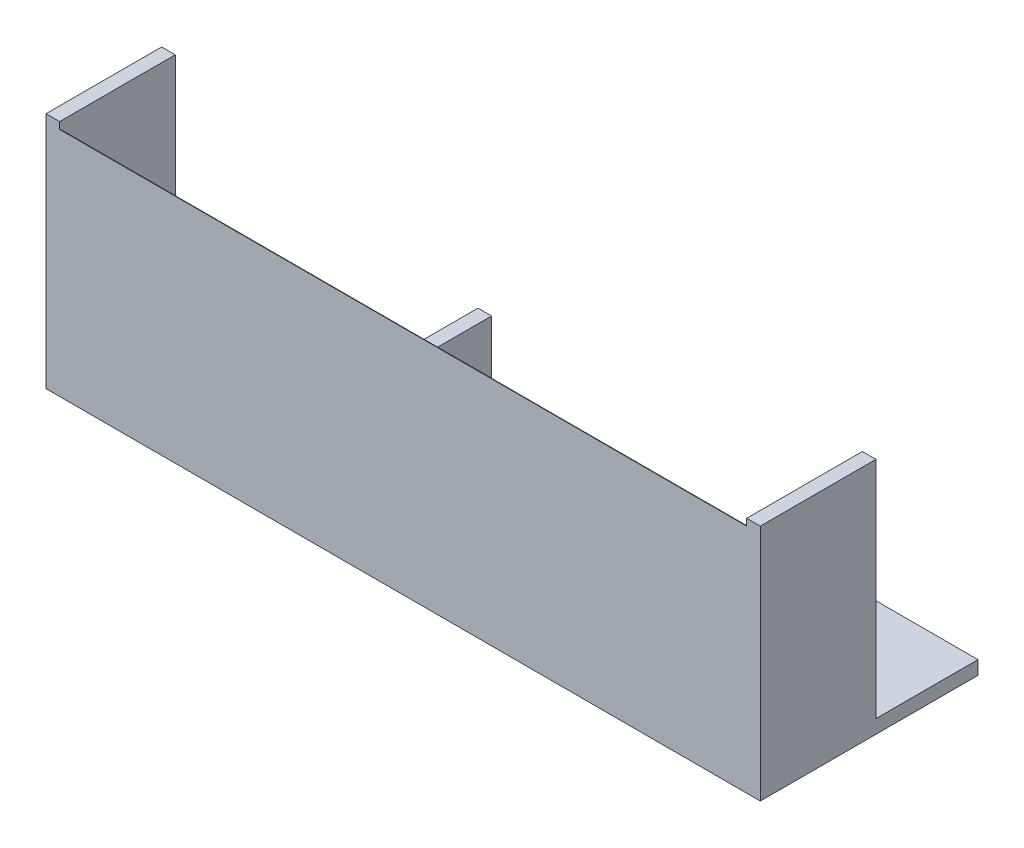
ISO-10303-21;
HEADER;
FILE_DESCRIPTION(('STEP AP214'),'2;1');
FILE_NAME('part.step','',(''),(''),'','','');
FILE_SCHEMA(('AUTOMOTIVE_DESIGN { 1 0 10303 214 1 1 1 1 }'));
ENDSEC;
DATA;
#1=APPLICATION_CONTEXT('core data for automotive mechanical design processes');
#2=APPLICATION_PROTOCOL_DEFINITION('international standard','automotive_design',2000,#1);
#3=PRODUCT_CONTEXT('',#1,'mechanical');
#4=PRODUCT('Part','Part','',(#3));
#5=PRODUCT_RELATED_PRODUCT_CATEGORY('part','',(#4));
#6=PRODUCT_DEFINITION_FORMATION('','',#4);
#7=PRODUCT_DEFINITION_CONTEXT('part definition',#1,'design');
#8=PRODUCT_DEFINITION('design','',#6,#7);
#9=PRODUCT_DEFINITION_SHAPE('','',#8);
#10=(LENGTH_UNIT() NAMED_UNIT(*) SI_UNIT(.MILLI.,.METRE.));
#11=(NAMED_UNIT(*) PLANE_ANGLE_UNIT() SI_UNIT($,.RADIAN.));
#12=(NAMED_UNIT(*) SI_UNIT($,.STERADIAN.) SOLID_ANGLE_UNIT());
#13=UNCERTAINTY_MEASURE_WITH_UNIT(LENGTH_MEASURE(1.E-05),#10,'distance_accuracy_value','');
#14=(GEOMETRIC_REPRESENTATION_CONTEXT(3) GLOBAL_UNCERTAINTY_ASSIGNED_CONTEXT((#13)) GLOBAL_UNIT_ASSIGNED_CONTEXT((#10,
#11,#12)) REPRESENTATION_CONTEXT('',''));
#15=CARTESIAN_POINT('',(0.,0.,0.));
#16=DIRECTION('',(0.,0.,1.));
#17=DIRECTION('',(1.,0.,0.));
#18=AXIS2_PLACEMENT_3D('',#15,#16,#17);
#19=CARTESIAN_POINT('',(0.,0.,0.));
#20=DIRECTION('',(0.,0.,1.));
#21=DIRECTION('',(1.,0.,0.));
#22=AXIS2_PLACEMENT_3D('',#19,#20,#21);
#23=PLANE('',#22);
#24=DIRECTION('',(0.,1.,0.));
#25=VECTOR('',#24,1.);
#26=CARTESIAN_POINT('',(-11.9657534246575,53.4349315068493,0.));
#27=LINE('',#26,#25);
#28=CARTESIAN_POINT('',(-11.9657534246575,53.4349315068493,0.));
#29=VERTEX_POINT('',#28);
#30=CARTESIAN_POINT('',(-11.9657534246575,109.434931506849,0.));
#31=VERTEX_POINT('',#30);
#32=EDGE_CURVE('E167',#29,#31,#27,.T.);
#33=ORIENTED_EDGE('',*,*,#32,.F.);
#34=DIRECTION('',(-1.,0.,0.));
#35=VECTOR('',#34,1.);
#36=CARTESIAN_POINT('',(-114.965753424658,53.4349315068493,0.));
#37=LINE('',#36,#35);
#38=CARTESIAN_POINT('',(-110.965753424658,53.4349315068493,0.));
#39=VERTEX_POINT('',#38);
#40=EDGE_CURVE('E209',#29,#39,#37,.T.);
#41=ORIENTED_EDGE('',*,*,#40,.T.);
#42=DIRECTION('',(0.,1.,0.));
#43=VECTOR('',#42,1.);
#44=CARTESIAN_POINT('',(-110.965753424658,119.434931506849,0.));
#45=LINE('',#44,#43);
#46=CARTESIAN_POINT('',(-110.965753424658,109.434931506849,0.));
#47=VERTEX_POINT('',#46);
#48=EDGE_CURVE('E190',#39,#47,#45,.T.);
#49=ORIENTED_EDGE('',*,*,#48,.T.);
#50=DIRECTION('',(-1.,0.,0.));
#51=VECTOR('',#50,1.);
#52=CARTESIAN_POINT('',(0.,109.434931506849,0.));
#53=LINE('',#52,#51);
#54=EDGE_CURVE('E262',#47,#31,#53,.F.);
#55=ORIENTED_EDGE('',*,*,#54,.T.);
#56=EDGE_LOOP('',(#33,#41,#49,#55));
#57=FACE_BOUND('',#56,.T.);
#58=ADVANCED_FACE('F36',(#57),#23,.F.);
#59=DIRECTION('',(0.,-1.,0.));
#60=VECTOR('',#59,1.);
#61=CARTESIAN_POINT('',(-7.96575342465753,53.4349315068493,0.));
#62=LINE('',#61,#60);
#63=CARTESIAN_POINT('',(-7.96575342465752,109.434931506849,0.));
#64=VERTEX_POINT('',#63);
#65=CARTESIAN_POINT('',(-7.96575342465752,53.4349315068493,0.));
#66=VERTEX_POINT('',#65);
#67=EDGE_CURVE('E164',#64,#66,#62,.T.);
#68=ORIENTED_EDGE('',*,*,#67,.F.);
#69=CARTESIAN_POINT('',(91.0342465753425,109.434931506849,0.));
#70=VERTEX_POINT('',#69);
#71=EDGE_CURVE('E261',#64,#70,#53,.F.);
#72=ORIENTED_EDGE('',*,*,#71,.T.);
#73=DIRECTION('',(0.,-1.,0.));
#74=VECTOR('',#73,1.);
#75=CARTESIAN_POINT('',(91.0342465753425,119.434931506849,0.));
#76=LINE('',#75,#74);
#77=CARTESIAN_POINT('',(91.0342465753425,53.4349315068493,0.));
#78=VERTEX_POINT('',#77);
#79=EDGE_CURVE('E168',#70,#78,#76,.T.);
#80=ORIENTED_EDGE('',*,*,#79,.T.);
#81=EDGE_CURVE('E216',#78,#66,#37,.T.);
#82=ORIENTED_EDGE('',*,*,#81,.T.);
#83=EDGE_LOOP('',(#68,#72,#80,#82));
#84=FACE_BOUND('',#83,.T.);
#85=ADVANCED_FACE('F287',(#84),#23,.F.);
#86=CARTESIAN_POINT('',(-114.965753424658,53.4349315068493,-60.));
#87=DIRECTION('',(0.,1.,0.));
#88=DIRECTION('',(0.,0.,1.));
#89=AXIS2_PLACEMENT_3D('',#86,#87,#88);
#90=PLANE('',#89);
#91=ORIENTED_EDGE('',*,*,#40,.F.);
#92=DIRECTION('',(0.,0.,1.));
#93=VECTOR('',#92,1.);
#94=CARTESIAN_POINT('',(-11.9657534246575,53.4349315068493,-20.));
#95=LINE('',#94,#93);
#96=CARTESIAN_POINT('',(-11.9657534246575,53.4349315068493,-20.));
#97=VERTEX_POINT('',#96);
#98=EDGE_CURVE('E51',#97,#29,#95,.T.);
#99=ORIENTED_EDGE('',*,*,#98,.F.);
#100=DIRECTION('',(-1.,0.,0.));
#101=VECTOR('',#100,1.);
#102=CARTESIAN_POINT('',(-11.9657534246575,53.4349315068493,-20.));
#103=LINE('',#102,#101);
#104=CARTESIAN_POINT('',(-7.96575342465752,53.4349315068493,-20.));
#105=VERTEX_POINT('',#104);
#106=EDGE_CURVE('E55',#105,#97,#103,.T.);
#107=ORIENTED_EDGE('',*,*,#106,.F.);
#108=DIRECTION('',(0.,0.,1.));
#109=VECTOR('',#108,1.);
#110=CARTESIAN_POINT('',(-7.96575342465753,53.4349315068493,-20.));
#111=LINE('',#110,#109);
#112=EDGE_CURVE('E172',#105,#66,#111,.T.);
#113=ORIENTED_EDGE('',*,*,#112,.T.);
#114=ORIENTED_EDGE('',*,*,#81,.F.);
#115=DIRECTION('',(0.,0.,1.));
#116=VECTOR('',#115,1.);
#117=CARTESIAN_POINT('',(91.0342465753425,53.4349315068493,-30.));
#118=LINE('',#117,#116);
#119=CARTESIAN_POINT('',(91.0342465753425,53.4349315068493,-30.));
#120=VERTEX_POINT('',#119);
#121=EDGE_CURVE('E187',#120,#78,#118,.T.);
#122=ORIENTED_EDGE('',*,*,#121,.F.);
#123=DIRECTION('',(1.,0.,0.));
#124=VECTOR('',#123,1.);
#125=CARTESIAN_POINT('',(95.0342465753425,53.4349315068493,-30.));
#126=LINE('',#125,#124);
#127=CARTESIAN_POINT('',(95.0342465753425,53.4349315068493,-30.));
#128=VERTEX_POINT('',#127);
#129=EDGE_CURVE('E184',#120,#128,#126,.T.);
#130=ORIENTED_EDGE('',*,*,#129,.T.);
#131=DIRECTION('',(0.,0.,1.));
#132=VECTOR('',#131,1.);
#133=CARTESIAN_POINT('',(95.0342465753425,53.4349315068493,-60.));
#134=LINE('',#133,#132);
#135=CARTESIAN_POINT('',(95.0342465753425,53.4349315068493,-60.));
#136=VERTEX_POINT('',#135);
#137=EDGE_CURVE('E225',#136,#128,#134,.T.);
#138=ORIENTED_EDGE('',*,*,#137,.F.);
#139=DIRECTION('',(-1.,0.,0.));
#140=VECTOR('',#139,1.);
#141=CARTESIAN_POINT('',(-114.965753424658,53.4349315068493,-60.));
#142=LINE('',#141,#140);
#143=CARTESIAN_POINT('',(-114.965753424658,53.4349315068493,-60.));
#144=VERTEX_POINT('',#143);
#145=EDGE_CURVE('E222',#136,#144,#142,.T.);
#146=ORIENTED_EDGE('',*,*,#145,.T.);
#147=DIRECTION('',(0.,0.,1.));
#148=VECTOR('',#147,1.);
#149=CARTESIAN_POINT('',(-114.965753424658,53.4349315068493,-60.));
#150=LINE('',#149,#148);
#151=CARTESIAN_POINT('',(-114.965753424658,53.4349315068493,-30.));
#152=VERTEX_POINT('',#151);
#153=EDGE_CURVE('E228',#144,#152,#150,.T.);
#154=ORIENTED_EDGE('',*,*,#153,.T.);
#155=DIRECTION('',(1.,0.,0.));
#156=VECTOR('',#155,1.);
#157=CARTESIAN_POINT('',(-114.965753424658,53.4349315068493,-30.));
#158=LINE('',#157,#156);
#159=CARTESIAN_POINT('',(-110.965753424658,53.4349315068493,-30.));
#160=VERTEX_POINT('',#159);
#161=EDGE_CURVE('E195',#152,#160,#158,.T.);
#162=ORIENTED_EDGE('',*,*,#161,.T.);
#163=DIRECTION('',(0.,0.,1.));
#164=VECTOR('',#163,1.);
#165=CARTESIAN_POINT('',(-110.965753424658,53.4349315068493,-30.));
#166=LINE('',#165,#164);
#167=EDGE_CURVE('E204',#160,#39,#166,.T.);
#168=ORIENTED_EDGE('',*,*,#167,.T.);
#169=EDGE_LOOP('',(#91,#99,#107,#113,#114,#122,#130,#138,#146,#154,#162,#168));
#170=FACE_BOUND('',#169,.T.);
#171=ADVANCED_FACE('F284',(#170),#90,.T.);
#172=CARTESIAN_POINT('',(-114.965753424658,119.434931506849,4.));
#173=DIRECTION('',(0.,-1.,0.));
#174=DIRECTION('',(0.,0.,-1.));
#175=AXIS2_PLACEMENT_3D('',#172,#173,#174);
#176=PLANE('',#175);
#177=DIRECTION('',(-1.,0.,0.));
#178=VECTOR('',#177,1.);
#179=CARTESIAN_POINT('',(-114.965753424658,119.434931506849,4.));
#180=LINE('',#179,#178);
#181=CARTESIAN_POINT('',(-110.965753424658,119.434931506849,4.));
#182=VERTEX_POINT('',#181);
#183=CARTESIAN_POINT('',(-114.965753424658,119.434931506849,4.));
#184=VERTEX_POINT('',#183);
#185=EDGE_CURVE('E236',#182,#184,#180,.T.);
#186=ORIENTED_EDGE('',*,*,#185,.F.);
#187=DIRECTION('',(0.,0.,1.));
#188=VECTOR('',#187,1.);
#189=CARTESIAN_POINT('',(-110.965753424658,119.434931506849,-30.));
#190=LINE('',#189,#188);
#191=CARTESIAN_POINT('',(-110.965753424658,119.434931506849,-30.));
#192=VERTEX_POINT('',#191);
#193=EDGE_CURVE('E207',#192,#182,#190,.T.);
#194=ORIENTED_EDGE('',*,*,#193,.F.);
#195=DIRECTION('',(-1.,0.,0.));
#196=VECTOR('',#195,1.);
#197=CARTESIAN_POINT('',(-114.965753424658,119.434931506849,-30.));
#198=LINE('',#197,#196);
#199=CARTESIAN_POINT('',(-114.965753424658,119.434931506849,-30.));
#200=VERTEX_POINT('',#199);
#201=EDGE_CURVE('E201',#192,#200,#198,.T.);
#202=ORIENTED_EDGE('',*,*,#201,.T.);
#203=DIRECTION('',(0.,0.,-1.));
#204=VECTOR('',#203,1.);
#205=CARTESIAN_POINT('',(-114.965753424658,119.434931506849,4.));
#206=LINE('',#205,#204);
#207=EDGE_CURVE('E248',#184,#200,#206,.T.);
#208=ORIENTED_EDGE('',*,*,#207,.F.);
#209=EDGE_LOOP('',(#186,#194,#202,#208));
#210=FACE_BOUND('',#209,.T.);
#211=ADVANCED_FACE('F320',(#210),#176,.F.);
#212=CARTESIAN_POINT('',(95.0342465753425,119.434931506849,4.));
#213=DIRECTION('',(-1.,0.,0.));
#214=DIRECTION('',(0.,0.,1.));
#215=AXIS2_PLACEMENT_3D('',#212,#213,#214);
#216=PLANE('',#215);
#217=DIRECTION('',(0.,1.,0.));
#218=VECTOR('',#217,1.);
#219=CARTESIAN_POINT('',(95.0342465753425,119.434931506849,-30.));
#220=LINE('',#219,#218);
#221=CARTESIAN_POINT('',(95.0342465753425,119.434931506849,-30.));
#222=VERTEX_POINT('',#221);
#223=EDGE_CURVE('E170',#128,#222,#220,.T.);
#224=ORIENTED_EDGE('',*,*,#223,.T.);
#225=DIRECTION('',(0.,0.,-1.));
#226=VECTOR('',#225,1.);
#227=CARTESIAN_POINT('',(95.0342465753425,119.434931506849,4.));
#228=LINE('',#227,#226);
#229=CARTESIAN_POINT('',(95.0342465753425,119.434931506849,4.));
#230=VERTEX_POINT('',#229);
#231=EDGE_CURVE('E250',#230,#222,#228,.T.);
#232=ORIENTED_EDGE('',*,*,#231,.F.);
#233=DIRECTION('',(0.,1.,0.));
#234=VECTOR('',#233,1.);
#235=CARTESIAN_POINT('',(95.0342465753425,119.434931506849,4.));
#236=LINE('',#235,#234);
#237=CARTESIAN_POINT('',(95.0342465753425,49.4349315068493,4.));
#238=VERTEX_POINT('',#237);
#239=EDGE_CURVE('E231',#238,#230,#236,.T.);
#240=ORIENTED_EDGE('',*,*,#239,.F.);
#241=DIRECTION('',(0.,0.,-1.));
#242=VECTOR('',#241,1.);
#243=CARTESIAN_POINT('',(95.0342465753425,49.4349315068493,4.));
#244=LINE('',#243,#242);
#245=CARTESIAN_POINT('',(95.0342465753425,49.4349315068493,-60.));
#246=VERTEX_POINT('',#245);
#247=EDGE_CURVE('E244',#238,#246,#244,.T.);
#248=ORIENTED_EDGE('',*,*,#247,.T.);
#249=DIRECTION('',(0.,1.,0.));
#250=VECTOR('',#249,1.);
#251=CARTESIAN_POINT('',(95.0342465753425,49.4349315068493,-60.));
#252=LINE('',#251,#250);
#253=EDGE_CURVE('E219',#246,#136,#252,.T.);
#254=ORIENTED_EDGE('',*,*,#253,.T.);
#255=ORIENTED_EDGE('',*,*,#137,.T.);
#256=EDGE_LOOP('',(#224,#232,#240,#248,#254,#255));
#257=FACE_BOUND('',#256,.T.);
#258=ADVANCED_FACE('F318',(#257),#216,.F.);
#259=DIRECTION('',(0.,0.,1.));
#260=VECTOR('',#259,1.);
#261=CARTESIAN_POINT('',(91.0342465753425,119.434931506849,-30.));
#262=LINE('',#261,#260);
#263=CARTESIAN_POINT('',(91.0342465753425,119.434931506849,-30.));
#264=VERTEX_POINT('',#263);
#265=CARTESIAN_POINT('',(91.0342465753425,119.434931506849,4.));
#266=VERTEX_POINT('',#265);
#267=EDGE_CURVE('E185',#264,#266,#262,.T.);
#268=ORIENTED_EDGE('',*,*,#267,.T.);
#269=EDGE_CURVE('E237',#230,#266,#180,.T.);
#270=ORIENTED_EDGE('',*,*,#269,.F.);
#271=ORIENTED_EDGE('',*,*,#231,.T.);
#272=DIRECTION('',(-1.,0.,0.));
#273=VECTOR('',#272,1.);
#274=CARTESIAN_POINT('',(95.0342465753425,119.434931506849,-30.));
#275=LINE('',#274,#273);
#276=EDGE_CURVE('E178',#222,#264,#275,.T.);
#277=ORIENTED_EDGE('',*,*,#276,.T.);
#278=EDGE_LOOP('',(#268,#270,#271,#277));
#279=FACE_BOUND('',#278,.T.);
#280=ADVANCED_FACE('F315',(#279),#176,.F.);
#281=CARTESIAN_POINT('',(-114.965753424658,119.434931506849,4.));
#282=DIRECTION('',(1.,0.,0.));
#283=DIRECTION('',(0.,1.,0.));
#284=AXIS2_PLACEMENT_3D('',#281,#282,#283);
#285=PLANE('',#284);
#286=ORIENTED_EDGE('',*,*,#207,.T.);
#287=DIRECTION('',(0.,-1.,0.));
#288=VECTOR('',#287,1.);
#289=CARTESIAN_POINT('',(-114.965753424658,119.434931506849,-30.));
#290=LINE('',#289,#288);
#291=EDGE_CURVE('E192',#200,#152,#290,.T.);
#292=ORIENTED_EDGE('',*,*,#291,.T.);
#293=ORIENTED_EDGE('',*,*,#153,.F.);
#294=DIRECTION('',(0.,-1.,0.));
#295=VECTOR('',#294,1.);
#296=CARTESIAN_POINT('',(-114.965753424658,49.4349315068493,-60.));
#297=LINE('',#296,#295);
#298=CARTESIAN_POINT('',(-114.965753424658,49.4349315068493,-60.));
#299=VERTEX_POINT('',#298);
#300=EDGE_CURVE('E212',#144,#299,#297,.T.);
#301=ORIENTED_EDGE('',*,*,#300,.T.);
#302=DIRECTION('',(0.,0.,-1.));
#303=VECTOR('',#302,1.);
#304=CARTESIAN_POINT('',(-114.965753424658,49.4349315068493,4.));
#305=LINE('',#304,#303);
#306=CARTESIAN_POINT('',(-114.965753424658,49.4349315068493,4.));
#307=VERTEX_POINT('',#306);
#308=EDGE_CURVE('E246',#307,#299,#305,.T.);
#309=ORIENTED_EDGE('',*,*,#308,.F.);
#310=DIRECTION('',(0.,-1.,0.));
#311=VECTOR('',#310,1.);
#312=CARTESIAN_POINT('',(-114.965753424658,119.434931506849,4.));
#313=LINE('',#312,#311);
#314=EDGE_CURVE('E240',#184,#307,#313,.T.);
#315=ORIENTED_EDGE('',*,*,#314,.F.);
#316=EDGE_LOOP('',(#286,#292,#293,#301,#309,#315));
#317=FACE_BOUND('',#316,.T.);
#318=ADVANCED_FACE('F311',(#317),#285,.F.);
#319=CARTESIAN_POINT('',(-114.965753424658,49.4349315068493,4.));
#320=DIRECTION('',(0.,1.,0.));
#321=DIRECTION('',(0.,0.,1.));
#322=AXIS2_PLACEMENT_3D('',#319,#320,#321);
#323=PLANE('',#322);
#324=ORIENTED_EDGE('',*,*,#308,.T.);
#325=DIRECTION('',(1.,0.,0.));
#326=VECTOR('',#325,1.);
#327=CARTESIAN_POINT('',(-114.965753424658,49.4349315068493,-60.));
#328=LINE('',#327,#326);
#329=EDGE_CURVE('E215',#299,#246,#328,.T.);
#330=ORIENTED_EDGE('',*,*,#329,.T.);
#331=ORIENTED_EDGE('',*,*,#247,.F.);
#332=DIRECTION('',(1.,0.,0.));
#333=VECTOR('',#332,1.);
#334=CARTESIAN_POINT('',(-114.965753424658,49.4349315068493,4.));
#335=LINE('',#334,#333);
#336=EDGE_CURVE('E242',#307,#238,#335,.T.);
#337=ORIENTED_EDGE('',*,*,#336,.F.);
#338=EDGE_LOOP('',(#324,#330,#331,#337));
#339=FACE_BOUND('',#338,.T.);
#340=ADVANCED_FACE('F308',(#339),#323,.F.);
#341=CARTESIAN_POINT('',(0.,0.,4.));
#342=DIRECTION('',(0.,0.,1.));
#343=DIRECTION('',(1.,0.,0.));
#344=AXIS2_PLACEMENT_3D('',#341,#342,#343);
#345=PLANE('',#344);
#346=DIRECTION('',(-1.,0.,0.));
#347=VECTOR('',#346,1.);
#348=CARTESIAN_POINT('',(-9.96575342465752,117.434931506849,4.));
#349=LINE('',#348,#347);
#350=CARTESIAN_POINT('',(91.0342465753425,117.434931506849,4.));
#351=VERTEX_POINT('',#350);
#352=CARTESIAN_POINT('',(-110.965753424658,117.434931506849,4.));
#353=VERTEX_POINT('',#352);
#354=EDGE_CURVE('E255',#351,#353,#349,.T.);
#355=ORIENTED_EDGE('',*,*,#354,.T.);
#356=DIRECTION('',(0.,1.,0.));
#357=VECTOR('',#356,1.);
#358=CARTESIAN_POINT('',(-110.965753424658,0.,4.));
#359=LINE('',#358,#357);
#360=EDGE_CURVE('E258',#353,#182,#359,.T.);
#361=ORIENTED_EDGE('',*,*,#360,.T.);
#362=ORIENTED_EDGE('',*,*,#185,.T.);
#363=ORIENTED_EDGE('',*,*,#314,.T.);
#364=ORIENTED_EDGE('',*,*,#336,.T.);
#365=ORIENTED_EDGE('',*,*,#239,.T.);
#366=ORIENTED_EDGE('',*,*,#269,.T.);
#367=DIRECTION('',(0.,-1.,0.));
#368=VECTOR('',#367,1.);
#369=CARTESIAN_POINT('',(91.0342465753425,0.,4.));
#370=LINE('',#369,#368);
#371=EDGE_CURVE('E252',#266,#351,#370,.T.);
#372=ORIENTED_EDGE('',*,*,#371,.T.);
#373=EDGE_LOOP('',(#355,#361,#362,#363,#364,#365,#366,#372));
#374=FACE_BOUND('',#373,.T.);
#375=ADVANCED_FACE('F306',(#374),#345,.T.);
#376=CARTESIAN_POINT('',(0.,0.,-60.));
#377=DIRECTION('',(0.,0.,-1.));
#378=DIRECTION('',(-1.,0.,0.));
#379=AXIS2_PLACEMENT_3D('',#376,#377,#378);
#380=PLANE('',#379);
#381=ORIENTED_EDGE('',*,*,#300,.F.);
#382=ORIENTED_EDGE('',*,*,#145,.F.);
#383=ORIENTED_EDGE('',*,*,#253,.F.);
#384=ORIENTED_EDGE('',*,*,#329,.F.);
#385=EDGE_LOOP('',(#381,#382,#383,#384));
#386=FACE_BOUND('',#385,.T.);
#387=ADVANCED_FACE('F344',(#386),#380,.T.);
#388=CARTESIAN_POINT('',(-110.965753424658,119.434931506849,-30.));
#389=DIRECTION('',(1.,0.,0.));
#390=DIRECTION('',(0.,0.,-1.));
#391=AXIS2_PLACEMENT_3D('',#388,#389,#390);
#392=PLANE('',#391);
#393=ORIENTED_EDGE('',*,*,#48,.F.);
#394=ORIENTED_EDGE('',*,*,#167,.F.);
#395=DIRECTION('',(0.,1.,0.));
#396=VECTOR('',#395,1.);
#397=CARTESIAN_POINT('',(-110.965753424658,119.434931506849,-30.));
#398=LINE('',#397,#396);
#399=EDGE_CURVE('E198',#160,#192,#398,.T.);
#400=ORIENTED_EDGE('',*,*,#399,.T.);
#401=ORIENTED_EDGE('',*,*,#193,.T.);
#402=ORIENTED_EDGE('',*,*,#360,.F.);
#403=CARTESIAN_POINT('',(-110.965753424658,109.434931506849,10.));
#404=DIRECTION('',(1.,0.,0.));
#405=DIRECTION('',(0.,0.,-1.));
#406=AXIS2_PLACEMENT_3D('',#403,#404,#405);
#407=CIRCLE('',#406,10.);
#408=EDGE_CURVE('E44',#353,#47,#407,.F.);
#409=ORIENTED_EDGE('',*,*,#408,.T.);
#410=EDGE_LOOP('',(#393,#394,#400,#401,#402,#409));
#411=FACE_BOUND('',#410,.T.);
#412=ADVANCED_FACE('F267',(#411),#392,.T.);
#413=CARTESIAN_POINT('',(0.,0.,-30.));
#414=DIRECTION('',(0.,0.,1.));
#415=DIRECTION('',(1.,0.,0.));
#416=AXIS2_PLACEMENT_3D('',#413,#414,#415);
#417=PLANE('',#416);
#418=ORIENTED_EDGE('',*,*,#291,.F.);
#419=ORIENTED_EDGE('',*,*,#201,.F.);
#420=ORIENTED_EDGE('',*,*,#399,.F.);
#421=ORIENTED_EDGE('',*,*,#161,.F.);
#422=EDGE_LOOP('',(#418,#419,#420,#421));
#423=FACE_BOUND('',#422,.T.);
#424=ADVANCED_FACE('F354',(#423),#417,.F.);
#425=CARTESIAN_POINT('',(91.0342465753425,119.434931506849,-30.));
#426=DIRECTION('',(-1.,0.,0.));
#427=DIRECTION('',(0.,-1.,0.));
#428=AXIS2_PLACEMENT_3D('',#425,#426,#427);
#429=PLANE('',#428);
#430=ORIENTED_EDGE('',*,*,#79,.F.);
#431=CARTESIAN_POINT('',(91.0342465753425,109.434931506849,10.));
#432=DIRECTION('',(-1.,0.,0.));
#433=DIRECTION('',(0.,-1.,0.));
#434=AXIS2_PLACEMENT_3D('',#431,#432,#433);
#435=CIRCLE('',#434,10.);
#436=EDGE_CURVE('E11',#70,#351,#435,.F.);
#437=ORIENTED_EDGE('',*,*,#436,.T.);
#438=ORIENTED_EDGE('',*,*,#371,.F.);
#439=ORIENTED_EDGE('',*,*,#267,.F.);
#440=DIRECTION('',(0.,-1.,0.));
#441=VECTOR('',#440,1.);
#442=CARTESIAN_POINT('',(91.0342465753425,119.434931506849,-30.));
#443=LINE('',#442,#441);
#444=EDGE_CURVE('E181',#264,#120,#443,.T.);
#445=ORIENTED_EDGE('',*,*,#444,.T.);
#446=ORIENTED_EDGE('',*,*,#121,.T.);
#447=EDGE_LOOP('',(#430,#437,#438,#439,#445,#446));
#448=FACE_BOUND('',#447,.T.);
#449=ADVANCED_FACE('F348',(#448),#429,.T.);
#450=CARTESIAN_POINT('',(0.,0.,-30.));
#451=DIRECTION('',(0.,0.,-1.));
#452=DIRECTION('',(-1.,0.,0.));
#453=AXIS2_PLACEMENT_3D('',#450,#451,#452);
#454=PLANE('',#453);
#455=ORIENTED_EDGE('',*,*,#223,.F.);
#456=ORIENTED_EDGE('',*,*,#129,.F.);
#457=ORIENTED_EDGE('',*,*,#444,.F.);
#458=ORIENTED_EDGE('',*,*,#276,.F.);
#459=EDGE_LOOP('',(#455,#456,#457,#458));
#460=FACE_BOUND('',#459,.T.);
#461=ADVANCED_FACE('F333',(#460),#454,.T.);
#462=CARTESIAN_POINT('',(-114.965753424658,109.434931506849,10.));
#463=DIRECTION('',(-1.,0.,0.));
#464=DIRECTION('',(0.,0.,1.));
#465=AXIS2_PLACEMENT_3D('',#462,#463,#464);
#466=CYLINDRICAL_SURFACE('',#465,10.);
#467=ORIENTED_EDGE('',*,*,#436,.F.);
#468=ORIENTED_EDGE('',*,*,#71,.F.);
#469=DIRECTION('',(1.,0.,0.));
#470=VECTOR('',#469,1.);
#471=CARTESIAN_POINT('',(-11.9657534246575,109.434931506849,0.));
#472=LINE('',#471,#470);
#473=EDGE_CURVE('E274',#31,#64,#472,.T.);
#474=ORIENTED_EDGE('',*,*,#473,.F.);
#475=ORIENTED_EDGE('',*,*,#54,.F.);
#476=ORIENTED_EDGE('',*,*,#408,.F.);
#477=ORIENTED_EDGE('',*,*,#354,.F.);
#478=EDGE_LOOP('',(#467,#468,#474,#475,#476,#477));
#479=FACE_BOUND('',#478,.T.);
#480=ADVANCED_FACE('F38',(#479),#466,.T.);
#481=CARTESIAN_POINT('',(-11.9657534246575,53.4349315068493,-20.));
#482=DIRECTION('',(1.,0.,0.));
#483=DIRECTION('',(0.,1.,0.));
#484=AXIS2_PLACEMENT_3D('',#481,#482,#483);
#485=PLANE('',#484);
#486=ORIENTED_EDGE('',*,*,#32,.T.);
#487=DIRECTION('',(0.,0.,1.));
#488=VECTOR('',#487,1.);
#489=CARTESIAN_POINT('',(-11.9657534246575,109.434931506849,-20.));
#490=LINE('',#489,#488);
#491=CARTESIAN_POINT('',(-11.9657534246575,109.434931506849,-20.));
#492=VERTEX_POINT('',#491);
#493=EDGE_CURVE('E152',#492,#31,#490,.T.);
#494=ORIENTED_EDGE('',*,*,#493,.F.);
#495=DIRECTION('',(0.,1.,0.));
#496=VECTOR('',#495,1.);
#497=CARTESIAN_POINT('',(-11.9657534246575,53.4349315068493,-20.));
#498=LINE('',#497,#496);
#499=EDGE_CURVE('E159',#97,#492,#498,.T.);
#500=ORIENTED_EDGE('',*,*,#499,.F.);
#501=ORIENTED_EDGE('',*,*,#98,.T.);
#502=EDGE_LOOP('',(#486,#494,#500,#501));
#503=FACE_BOUND('',#502,.T.);
#504=ADVANCED_FACE('F166',(#503),#485,.F.);
#505=CARTESIAN_POINT('',(-11.9657534246575,109.434931506849,-20.));
#506=DIRECTION('',(0.,-1.,0.));
#507=DIRECTION('',(0.,0.,-1.));
#508=AXIS2_PLACEMENT_3D('',#505,#506,#507);
#509=PLANE('',#508);
#510=ORIENTED_EDGE('',*,*,#473,.T.);
#511=DIRECTION('',(0.,0.,1.));
#512=VECTOR('',#511,1.);
#513=CARTESIAN_POINT('',(-7.96575342465752,109.434931506849,-20.));
#514=LINE('',#513,#512);
#515=CARTESIAN_POINT('',(-7.96575342465752,109.434931506849,-20.));
#516=VERTEX_POINT('',#515);
#517=EDGE_CURVE('E155',#516,#64,#514,.T.);
#518=ORIENTED_EDGE('',*,*,#517,.F.);
#519=DIRECTION('',(1.,0.,0.));
#520=VECTOR('',#519,1.);
#521=CARTESIAN_POINT('',(-11.9657534246575,109.434931506849,-20.));
#522=LINE('',#521,#520);
#523=EDGE_CURVE('E147',#492,#516,#522,.T.);
#524=ORIENTED_EDGE('',*,*,#523,.F.);
#525=ORIENTED_EDGE('',*,*,#493,.T.);
#526=EDGE_LOOP('',(#510,#518,#524,#525));
#527=FACE_BOUND('',#526,.T.);
#528=ADVANCED_FACE('F150',(#527),#509,.F.);
#529=CARTESIAN_POINT('',(-7.96575342465753,53.4349315068493,-20.));
#530=DIRECTION('',(-1.,0.,0.));
#531=DIRECTION('',(0.,-1.,0.));
#532=AXIS2_PLACEMENT_3D('',#529,#530,#531);
#533=PLANE('',#532);
#534=ORIENTED_EDGE('',*,*,#67,.T.);
#535=ORIENTED_EDGE('',*,*,#112,.F.);
#536=DIRECTION('',(0.,-1.,0.));
#537=VECTOR('',#536,1.);
#538=CARTESIAN_POINT('',(-7.96575342465753,53.4349315068493,-20.));
#539=LINE('',#538,#537);
#540=EDGE_CURVE('E158',#516,#105,#539,.T.);
#541=ORIENTED_EDGE('',*,*,#540,.F.);
#542=ORIENTED_EDGE('',*,*,#517,.T.);
#543=EDGE_LOOP('',(#534,#535,#541,#542));
#544=FACE_BOUND('',#543,.T.);
#545=ADVANCED_FACE('F289',(#544),#533,.F.);
#546=CARTESIAN_POINT('',(0.,0.,-20.));
#547=DIRECTION('',(0.,0.,-1.));
#548=DIRECTION('',(-1.,0.,0.));
#549=AXIS2_PLACEMENT_3D('',#546,#547,#548);
#550=PLANE('',#549);
#551=ORIENTED_EDGE('',*,*,#499,.T.);
#552=ORIENTED_EDGE('',*,*,#523,.T.);
#553=ORIENTED_EDGE('',*,*,#540,.T.);
#554=ORIENTED_EDGE('',*,*,#106,.T.);
#555=EDGE_LOOP('',(#551,#552,#553,#554));
#556=FACE_BOUND('',#555,.T.);
#557=ADVANCED_FACE('F162',(#556),#550,.T.);
#558=CLOSED_SHELL('',(#58,#85,#171,#211,#258,#280,#318,#340,#375,#387,#412,#424,#449,#461,#480,
#504,#528,#545,#557));
#559=MANIFOLD_SOLID_BREP('B2',#558);
#560=ADVANCED_BREP_SHAPE_REPRESENTATION('',(#18,#559),#14);
#561=SHAPE_DEFINITION_REPRESENTATION(#9,#560);
ENDSEC;
END-ISO-10303-21;
